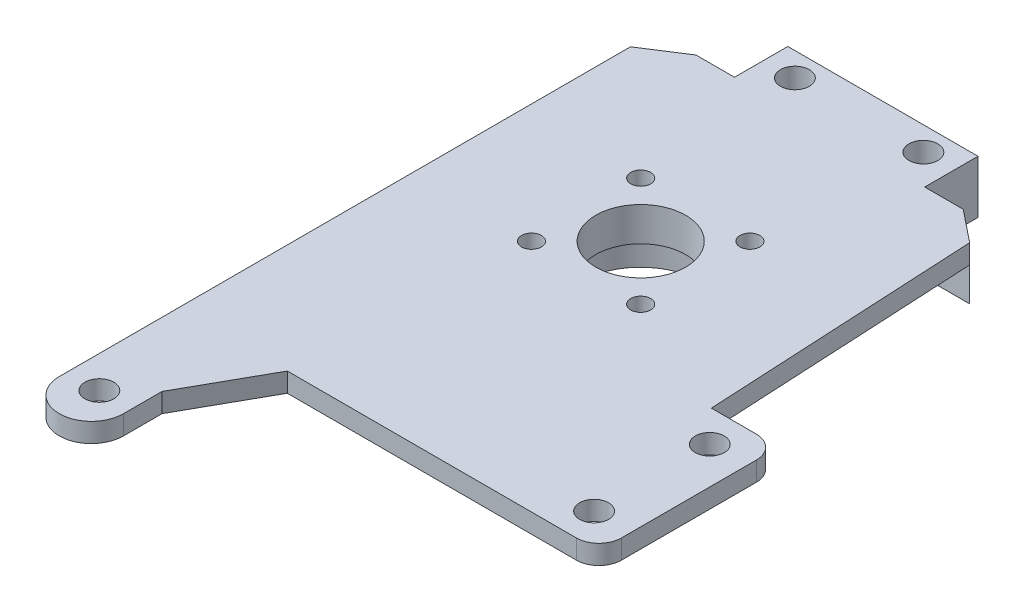
ISO-10303-21;
HEADER;
FILE_DESCRIPTION(('STEP AP214'),'2;1');
FILE_NAME('part.step','',(''),(''),'','','');
FILE_SCHEMA(('AUTOMOTIVE_DESIGN { 1 0 10303 214 1 1 1 1 }'));
ENDSEC;
DATA;
#1=APPLICATION_CONTEXT('core data for automotive mechanical design processes');
#2=APPLICATION_PROTOCOL_DEFINITION('international standard','automotive_design',2000,#1);
#3=PRODUCT_CONTEXT('',#1,'mechanical');
#4=PRODUCT('Part','Part','',(#3));
#5=PRODUCT_RELATED_PRODUCT_CATEGORY('part','',(#4));
#6=PRODUCT_DEFINITION_FORMATION('','',#4);
#7=PRODUCT_DEFINITION_CONTEXT('part definition',#1,'design');
#8=PRODUCT_DEFINITION('design','',#6,#7);
#9=PRODUCT_DEFINITION_SHAPE('','',#8);
#10=(LENGTH_UNIT() NAMED_UNIT(*) SI_UNIT(.MILLI.,.METRE.));
#11=(NAMED_UNIT(*) PLANE_ANGLE_UNIT() SI_UNIT($,.RADIAN.));
#12=(NAMED_UNIT(*) SI_UNIT($,.STERADIAN.) SOLID_ANGLE_UNIT());
#13=UNCERTAINTY_MEASURE_WITH_UNIT(LENGTH_MEASURE(1.E-05),#10,'distance_accuracy_value','');
#14=(GEOMETRIC_REPRESENTATION_CONTEXT(3) GLOBAL_UNCERTAINTY_ASSIGNED_CONTEXT((#13)) GLOBAL_UNIT_ASSIGNED_CONTEXT((#10,
#11,#12)) REPRESENTATION_CONTEXT('',''));
#15=CARTESIAN_POINT('',(0.,0.,0.));
#16=DIRECTION('',(0.,0.,1.));
#17=DIRECTION('',(1.,0.,0.));
#18=AXIS2_PLACEMENT_3D('',#15,#16,#17);
#19=CARTESIAN_POINT('',(0.,3.,4.59999999999998));
#20=DIRECTION('',(0.,0.,1.));
#21=DIRECTION('',(1.,0.,0.));
#22=AXIS2_PLACEMENT_3D('',#19,#20,#21);
#23=PLANE('',#22);
#24=DIRECTION('',(-1.,0.,0.));
#25=VECTOR('',#24,1.);
#26=CARTESIAN_POINT('',(0.,3.,4.59999999999998));
#27=LINE('',#26,#25);
#28=CARTESIAN_POINT('',(-14.8,3.,4.59999999999998));
#29=VERTEX_POINT('',#28);
#30=CARTESIAN_POINT('',(-20.8,3.,4.59999999999999));
#31=VERTEX_POINT('',#30);
#32=EDGE_CURVE('E359',#29,#31,#27,.T.);
#33=ORIENTED_EDGE('',*,*,#32,.F.);
#34=DIRECTION('',(0.,-1.,0.));
#35=VECTOR('',#34,1.);
#36=CARTESIAN_POINT('',(-14.8,3.,4.59999999999998));
#37=LINE('',#36,#35);
#38=CARTESIAN_POINT('',(-14.8,-5.25,4.59999999999998));
#39=VERTEX_POINT('',#38);
#40=EDGE_CURVE('E269',#29,#39,#37,.T.);
#41=ORIENTED_EDGE('',*,*,#40,.T.);
#42=DIRECTION('',(-1.,0.,0.));
#43=VECTOR('',#42,1.);
#44=CARTESIAN_POINT('',(0.,-5.25,4.59999999999998));
#45=LINE('',#44,#43);
#46=CARTESIAN_POINT('',(-20.8,-5.25,4.59999999999999));
#47=VERTEX_POINT('',#46);
#48=EDGE_CURVE('E240',#39,#47,#45,.T.);
#49=ORIENTED_EDGE('',*,*,#48,.T.);
#50=DIRECTION('',(0.,-1.,0.));
#51=VECTOR('',#50,1.);
#52=CARTESIAN_POINT('',(-20.8,3.,4.59999999999999));
#53=LINE('',#52,#51);
#54=EDGE_CURVE('E222',#31,#47,#53,.T.);
#55=ORIENTED_EDGE('',*,*,#54,.F.);
#56=EDGE_LOOP('',(#33,#41,#49,#55));
#57=FACE_BOUND('',#56,.T.);
#58=ADVANCED_FACE('F34',(#57),#23,.F.);
#59=CARTESIAN_POINT('',(0.,0.,0.));
#60=DIRECTION('',(0.,1.,0.));
#61=DIRECTION('',(0.,0.,1.));
#62=AXIS2_PLACEMENT_3D('',#59,#60,#61);
#63=PLANE('',#62);
#64=CARTESIAN_POINT('',(32.7500000000009,0.,55.9999999999991));
#65=DIRECTION('',(0.,1.,0.));
#66=DIRECTION('',(0.,0.,1.));
#67=AXIS2_PLACEMENT_3D('',#64,#65,#66);
#68=CIRCLE('',#67,2.24999999999883);
#69=CARTESIAN_POINT('',(32.7500000000009,0.,58.2499999999979));
#70=VERTEX_POINT('',#69);
#71=EDGE_CURVE('E342',#70,#70,#68,.T.);
#72=ORIENTED_EDGE('',*,*,#71,.T.);
#73=EDGE_LOOP('',(#72));
#74=FACE_BOUND('',#73,.T.);
#75=CARTESIAN_POINT('',(32.7500000000004,0.,73.9999999999994));
#76=DIRECTION('',(0.,1.,0.));
#77=DIRECTION('',(0.,0.,1.));
#78=AXIS2_PLACEMENT_3D('',#75,#76,#77);
#79=CIRCLE('',#78,2.24999999999944);
#80=CARTESIAN_POINT('',(32.7500000000004,0.,76.2499999999989));
#81=VERTEX_POINT('',#80);
#82=EDGE_CURVE('E416',#81,#81,#79,.T.);
#83=ORIENTED_EDGE('',*,*,#82,.T.);
#84=EDGE_LOOP('',(#83));
#85=FACE_BOUND('',#84,.T.);
#86=CARTESIAN_POINT('',(-22.0000000000012,0.,96.2500000000008));
#87=DIRECTION('',(0.,1.,0.));
#88=DIRECTION('',(0.,0.,1.));
#89=AXIS2_PLACEMENT_3D('',#86,#87,#88);
#90=CIRCLE('',#89,2.25000000000025);
#91=CARTESIAN_POINT('',(-22.0000000000012,0.,98.5000000000011));
#92=VERTEX_POINT('',#91);
#93=EDGE_CURVE('E413',#92,#92,#90,.T.);
#94=ORIENTED_EDGE('',*,*,#93,.T.);
#95=EDGE_LOOP('',(#94));
#96=FACE_BOUND('',#95,.T.);
#97=CARTESIAN_POINT('',(-8.5,0.,42.5));
#98=DIRECTION('',(0.,1.,0.));
#99=DIRECTION('',(0.,0.,1.));
#100=AXIS2_PLACEMENT_3D('',#97,#98,#99);
#101=CIRCLE('',#100,1.55);
#102=CARTESIAN_POINT('',(-7.80970070497113,0.,43.8877992950289));
#103=VERTEX_POINT('',#102);
#104=CARTESIAN_POINT('',(-9.88779929502888,0.,41.8097007049711));
#105=VERTEX_POINT('',#104);
#106=EDGE_CURVE('E313',#103,#105,#101,.F.);
#107=ORIENTED_EDGE('',*,*,#106,.F.);
#108=CARTESIAN_POINT('',(0.,0.,34.));
#109=DIRECTION('',(0.,1.,0.));
#110=DIRECTION('',(0.,0.,1.));
#111=AXIS2_PLACEMENT_3D('',#108,#109,#110);
#112=CIRCLE('',#111,12.6);
#113=CARTESIAN_POINT('',(7.80970070497112,0.,43.8877992950289));
#114=VERTEX_POINT('',#113);
#115=EDGE_CURVE('E333',#114,#103,#112,.F.);
#116=ORIENTED_EDGE('',*,*,#115,.F.);
#117=CARTESIAN_POINT('',(8.5,0.,42.5));
#118=DIRECTION('',(0.,1.,0.));
#119=DIRECTION('',(0.,0.,1.));
#120=AXIS2_PLACEMENT_3D('',#117,#118,#119);
#121=CIRCLE('',#120,1.55);
#122=CARTESIAN_POINT('',(9.88779929502888,0.,41.8097007049711));
#123=VERTEX_POINT('',#122);
#124=EDGE_CURVE('E307',#123,#114,#121,.F.);
#125=ORIENTED_EDGE('',*,*,#124,.F.);
#126=CARTESIAN_POINT('',(9.88779929502888,0.,26.1902992950289));
#127=VERTEX_POINT('',#126);
#128=EDGE_CURVE('E336',#127,#123,#112,.F.);
#129=ORIENTED_EDGE('',*,*,#128,.F.);
#130=CARTESIAN_POINT('',(8.5,0.,25.5));
#131=DIRECTION('',(0.,1.,0.));
#132=DIRECTION('',(0.,0.,1.));
#133=AXIS2_PLACEMENT_3D('',#130,#131,#132);
#134=CIRCLE('',#133,1.55);
#135=CARTESIAN_POINT('',(7.80970070497112,0.,24.1122007049711));
#136=VERTEX_POINT('',#135);
#137=EDGE_CURVE('E301',#136,#127,#134,.F.);
#138=ORIENTED_EDGE('',*,*,#137,.F.);
#139=CARTESIAN_POINT('',(-7.80970070497112,0.,24.1122007049711));
#140=VERTEX_POINT('',#139);
#141=EDGE_CURVE('E464',#140,#136,#112,.F.);
#142=ORIENTED_EDGE('',*,*,#141,.F.);
#143=CARTESIAN_POINT('',(-8.5,0.,25.5));
#144=DIRECTION('',(0.,1.,0.));
#145=DIRECTION('',(0.,0.,1.));
#146=AXIS2_PLACEMENT_3D('',#143,#144,#145);
#147=CIRCLE('',#146,1.55);
#148=CARTESIAN_POINT('',(-9.88779929502888,0.,26.1902992950289));
#149=VERTEX_POINT('',#148);
#150=EDGE_CURVE('E296',#149,#140,#147,.F.);
#151=ORIENTED_EDGE('',*,*,#150,.F.);
#152=EDGE_CURVE('E337',#105,#149,#112,.F.);
#153=ORIENTED_EDGE('',*,*,#152,.F.);
#154=EDGE_LOOP('',(#107,#116,#125,#129,#138,#142,#151,#153));
#155=FACE_BOUND('',#154,.T.);
#156=DIRECTION('',(-1.,0.,0.));
#157=VECTOR('',#156,1.);
#158=CARTESIAN_POINT('',(0.,0.,8.59999999999999));
#159=LINE('',#158,#157);
#160=CARTESIAN_POINT('',(25.8,0.,8.59999999999999));
#161=VERTEX_POINT('',#160);
#162=CARTESIAN_POINT('',(-27.0000000000001,0.,8.59999999999999));
#163=VERTEX_POINT('',#162);
#164=EDGE_CURVE('E11',#161,#163,#159,.T.);
#165=ORIENTED_EDGE('',*,*,#164,.F.);
#166=DIRECTION('',(0.0518170873393403,0.,0.998656592357787));
#167=VECTOR('',#166,1.);
#168=CARTESIAN_POINT('',(25.2856984355928,0.,-1.31199378675299));
#169=LINE('',#168,#167);
#170=CARTESIAN_POINT('',(28.0000000000009,0.,51.0000000000002));
#171=VERTEX_POINT('',#170);
#172=EDGE_CURVE('E399',#161,#171,#169,.T.);
#173=ORIENTED_EDGE('',*,*,#172,.T.);
#174=DIRECTION('',(1.,0.,0.));
#175=VECTOR('',#174,1.);
#176=CARTESIAN_POINT('',(-4.54993185984773E-13,0.,51.));
#177=LINE('',#176,#175);
#178=CARTESIAN_POINT('',(35.0000000000009,0.,51.0000000000003));
#179=VERTEX_POINT('',#178);
#180=EDGE_CURVE('E396',#171,#179,#177,.T.);
#181=ORIENTED_EDGE('',*,*,#180,.T.);
#182=CARTESIAN_POINT('',(35.0000000000009,0.,54.5000000000003));
#183=DIRECTION('',(0.,1.,0.));
#184=DIRECTION('',(0.,0.,1.));
#185=AXIS2_PLACEMENT_3D('',#182,#183,#184);
#186=CIRCLE('',#185,3.49999999999988);
#187=CARTESIAN_POINT('',(38.5000000000007,0.,54.5000000000013));
#188=VERTEX_POINT('',#187);
#189=EDGE_CURVE('E393',#179,#188,#186,.F.);
#190=ORIENTED_EDGE('',*,*,#189,.T.);
#191=DIRECTION('',(0.,0.,1.));
#192=VECTOR('',#191,1.);
#193=CARTESIAN_POINT('',(38.5000000000009,0.,1.39934360395466E-13));
#194=LINE('',#193,#192);
#195=CARTESIAN_POINT('',(38.5000000000006,0.,75.5000000000013));
#196=VERTEX_POINT('',#195);
#197=EDGE_CURVE('E390',#188,#196,#194,.T.);
#198=ORIENTED_EDGE('',*,*,#197,.T.);
#199=CARTESIAN_POINT('',(35.0000000000007,0.,75.5000000000003));
#200=DIRECTION('',(0.,1.,0.));
#201=DIRECTION('',(0.,0.,1.));
#202=AXIS2_PLACEMENT_3D('',#199,#200,#201);
#203=CIRCLE('',#202,3.49999999999992);
#204=CARTESIAN_POINT('',(35.0000000000007,0.,79.0000000000003));
#205=VERTEX_POINT('',#204);
#206=EDGE_CURVE('E387',#196,#205,#203,.F.);
#207=ORIENTED_EDGE('',*,*,#206,.T.);
#208=DIRECTION('',(-1.,0.,0.));
#209=VECTOR('',#208,1.);
#210=CARTESIAN_POINT('',(-3.16721957302788E-13,0.,79.0000000000001));
#211=LINE('',#210,#209);
#212=CARTESIAN_POINT('',(-9.9999999999993,0.,79.0000000000001));
#213=VERTEX_POINT('',#212);
#214=EDGE_CURVE('E384',#205,#213,#211,.T.);
#215=ORIENTED_EDGE('',*,*,#214,.T.);
#216=DIRECTION('',(0.488603368931869,0.,-0.872506015949706));
#217=VECTOR('',#216,1.);
#218=CARTESIAN_POINT('',(26.0657734470179,0.,14.596833130331));
#219=LINE('',#218,#217);
#220=CARTESIAN_POINT('',(-17.0000000000002,0.,91.5000000000008));
#221=VERTEX_POINT('',#220);
#222=EDGE_CURVE('E410',#221,#213,#219,.T.);
#223=ORIENTED_EDGE('',*,*,#222,.F.);
#224=DIRECTION('',(0.,0.,1.));
#225=VECTOR('',#224,1.);
#226=CARTESIAN_POINT('',(-17.0000000000001,0.,0.));
#227=LINE('',#226,#225);
#228=CARTESIAN_POINT('',(-17.0000000000002,0.,97.5000000000008));
#229=VERTEX_POINT('',#228);
#230=EDGE_CURVE('E407',#221,#229,#227,.T.);
#231=ORIENTED_EDGE('',*,*,#230,.T.);
#232=CARTESIAN_POINT('',(-22.0000000000002,0.,97.5000000000008));
#233=DIRECTION('',(0.,1.,0.));
#234=DIRECTION('',(0.,0.,1.));
#235=AXIS2_PLACEMENT_3D('',#232,#233,#234);
#236=CIRCLE('',#235,5.);
#237=CARTESIAN_POINT('',(-27.0000000000002,0.,97.5000000000008));
#238=VERTEX_POINT('',#237);
#239=EDGE_CURVE('E404',#238,#229,#236,.T.);
#240=ORIENTED_EDGE('',*,*,#239,.F.);
#241=DIRECTION('',(0.,0.,1.));
#242=VECTOR('',#241,1.);
#243=CARTESIAN_POINT('',(-27.0000000000002,0.,0.));
#244=LINE('',#243,#242);
#245=EDGE_CURVE('E402',#163,#238,#244,.T.);
#246=ORIENTED_EDGE('',*,*,#245,.F.);
#247=EDGE_LOOP('',(#165,#173,#181,#190,#198,#207,#215,#223,#231,#240,#246));
#248=FACE_BOUND('',#247,.T.);
#249=ADVANCED_FACE('F484',(#74,#85,#96,#155,#248),#63,.F.);
#250=CARTESIAN_POINT('',(0.,3.,0.));
#251=DIRECTION('',(0.,1.,0.));
#252=DIRECTION('',(0.,0.,1.));
#253=AXIS2_PLACEMENT_3D('',#250,#251,#252);
#254=PLANE('',#253);
#255=DIRECTION('',(0.840296648224249,0.,-0.542126869822085));
#256=VECTOR('',#255,1.);
#257=CARTESIAN_POINT('',(-4.01763409257883,3.,-6.22733284349732));
#258=LINE('',#257,#256);
#259=CARTESIAN_POINT('',(-27.0000000000001,3.,8.59999999999999));
#260=VERTEX_POINT('',#259);
#261=EDGE_CURVE('E363',#260,#31,#258,.T.);
#262=ORIENTED_EDGE('',*,*,#261,.F.);
#263=DIRECTION('',(0.,0.,1.));
#264=VECTOR('',#263,1.);
#265=CARTESIAN_POINT('',(-27.0000000000002,3.,0.));
#266=LINE('',#265,#264);
#267=CARTESIAN_POINT('',(-27.0000000000002,3.,97.5000000000008));
#268=VERTEX_POINT('',#267);
#269=EDGE_CURVE('E365',#260,#268,#266,.T.);
#270=ORIENTED_EDGE('',*,*,#269,.T.);
#271=CARTESIAN_POINT('',(-22.0000000000002,3.,97.5000000000008));
#272=DIRECTION('',(0.,1.,0.));
#273=DIRECTION('',(0.,0.,1.));
#274=AXIS2_PLACEMENT_3D('',#271,#272,#273);
#275=CIRCLE('',#274,5.);
#276=CARTESIAN_POINT('',(-17.0000000000002,3.,97.5000000000008));
#277=VERTEX_POINT('',#276);
#278=EDGE_CURVE('E367',#268,#277,#275,.T.);
#279=ORIENTED_EDGE('',*,*,#278,.T.);
#280=DIRECTION('',(0.,0.,1.));
#281=VECTOR('',#280,1.);
#282=CARTESIAN_POINT('',(-17.0000000000001,3.,0.));
#283=LINE('',#282,#281);
#284=CARTESIAN_POINT('',(-17.0000000000002,3.,91.5000000000008));
#285=VERTEX_POINT('',#284);
#286=EDGE_CURVE('E369',#285,#277,#283,.T.);
#287=ORIENTED_EDGE('',*,*,#286,.F.);
#288=DIRECTION('',(0.488603368931869,0.,-0.872506015949706));
#289=VECTOR('',#288,1.);
#290=CARTESIAN_POINT('',(26.0657734470179,3.,14.596833130331));
#291=LINE('',#290,#289);
#292=CARTESIAN_POINT('',(-9.9999999999993,3.,79.0000000000001));
#293=VERTEX_POINT('',#292);
#294=EDGE_CURVE('E372',#285,#293,#291,.T.);
#295=ORIENTED_EDGE('',*,*,#294,.T.);
#296=DIRECTION('',(-1.,0.,0.));
#297=VECTOR('',#296,1.);
#298=CARTESIAN_POINT('',(-3.16721957302788E-13,3.,79.0000000000001));
#299=LINE('',#298,#297);
#300=CARTESIAN_POINT('',(35.0000000000007,3.,79.0000000000003));
#301=VERTEX_POINT('',#300);
#302=EDGE_CURVE('E338',#301,#293,#299,.T.);
#303=ORIENTED_EDGE('',*,*,#302,.F.);
#304=CARTESIAN_POINT('',(35.0000000000007,3.,75.5000000000003));
#305=DIRECTION('',(0.,1.,0.));
#306=DIRECTION('',(0.,0.,1.));
#307=AXIS2_PLACEMENT_3D('',#304,#305,#306);
#308=CIRCLE('',#307,3.49999999999992);
#309=CARTESIAN_POINT('',(38.5000000000006,3.,75.5000000000013));
#310=VERTEX_POINT('',#309);
#311=EDGE_CURVE('E341',#310,#301,#308,.F.);
#312=ORIENTED_EDGE('',*,*,#311,.F.);
#313=DIRECTION('',(0.,0.,1.));
#314=VECTOR('',#313,1.);
#315=CARTESIAN_POINT('',(38.5000000000009,3.,1.39934360395466E-13));
#316=LINE('',#315,#314);
#317=CARTESIAN_POINT('',(38.5000000000007,3.,54.5000000000013));
#318=VERTEX_POINT('',#317);
#319=EDGE_CURVE('E345',#318,#310,#316,.T.);
#320=ORIENTED_EDGE('',*,*,#319,.F.);
#321=CARTESIAN_POINT('',(35.0000000000009,3.,54.5000000000003));
#322=DIRECTION('',(0.,1.,0.));
#323=DIRECTION('',(0.,0.,1.));
#324=AXIS2_PLACEMENT_3D('',#321,#322,#323);
#325=CIRCLE('',#324,3.49999999999988);
#326=CARTESIAN_POINT('',(35.0000000000009,3.,51.0000000000003));
#327=VERTEX_POINT('',#326);
#328=EDGE_CURVE('E348',#327,#318,#325,.F.);
#329=ORIENTED_EDGE('',*,*,#328,.F.);
#330=DIRECTION('',(1.,0.,0.));
#331=VECTOR('',#330,1.);
#332=CARTESIAN_POINT('',(-4.54993185984773E-13,3.,51.));
#333=LINE('',#332,#331);
#334=CARTESIAN_POINT('',(28.0000000000009,3.,51.0000000000002));
#335=VERTEX_POINT('',#334);
#336=EDGE_CURVE('E351',#335,#327,#333,.T.);
#337=ORIENTED_EDGE('',*,*,#336,.F.);
#338=DIRECTION('',(0.0518170873393403,0.,0.998656592357787));
#339=VECTOR('',#338,1.);
#340=CARTESIAN_POINT('',(25.2856984355928,3.,-1.31199378675299));
#341=LINE('',#340,#339);
#342=CARTESIAN_POINT('',(25.8,3.,8.59999999999999));
#343=VERTEX_POINT('',#342);
#344=EDGE_CURVE('E354',#343,#335,#341,.T.);
#345=ORIENTED_EDGE('',*,*,#344,.F.);
#346=DIRECTION('',(-0.780868809443032,0.,-0.624695047554423));
#347=VECTOR('',#346,1.);
#348=CARTESIAN_POINT('',(5.87317073170727,3.,-7.34146341463412));
#349=LINE('',#348,#347);
#350=CARTESIAN_POINT('',(20.8,3.,4.6));
#351=VERTEX_POINT('',#350);
#352=EDGE_CURVE('E357',#343,#351,#349,.T.);
#353=ORIENTED_EDGE('',*,*,#352,.T.);
#354=CARTESIAN_POINT('',(14.8,3.,4.6));
#355=VERTEX_POINT('',#354);
#356=EDGE_CURVE('E360',#351,#355,#27,.T.);
#357=ORIENTED_EDGE('',*,*,#356,.T.);
#358=DIRECTION('',(0.,0.,1.));
#359=VECTOR('',#358,1.);
#360=CARTESIAN_POINT('',(14.8,3.,0.));
#361=LINE('',#360,#359);
#362=CARTESIAN_POINT('',(14.8,3.,-3.70000000000001));
#363=VERTEX_POINT('',#362);
#364=EDGE_CURVE('E255',#363,#355,#361,.T.);
#365=ORIENTED_EDGE('',*,*,#364,.F.);
#366=DIRECTION('',(1.,0.,0.));
#367=VECTOR('',#366,1.);
#368=CARTESIAN_POINT('',(0.,3.,-3.70000000000025));
#369=LINE('',#368,#367);
#370=CARTESIAN_POINT('',(-14.8,3.,-3.7000000000005));
#371=VERTEX_POINT('',#370);
#372=EDGE_CURVE('E257',#371,#363,#369,.T.);
#373=ORIENTED_EDGE('',*,*,#372,.F.);
#374=DIRECTION('',(0.,0.,1.));
#375=VECTOR('',#374,1.);
#376=CARTESIAN_POINT('',(-14.8,3.,0.));
#377=LINE('',#376,#375);
#378=EDGE_CURVE('E260',#371,#29,#377,.T.);
#379=ORIENTED_EDGE('',*,*,#378,.T.);
#380=ORIENTED_EDGE('',*,*,#32,.T.);
#381=EDGE_LOOP('',(#262,#270,#279,#287,#295,#303,#312,#320,#329,#337,#345,#353,#357,#365,#373,
#379,#380));
#382=FACE_BOUND('',#381,.T.);
#383=CARTESIAN_POINT('',(-10.,3.,0.));
#384=DIRECTION('',(0.,1.,0.));
#385=DIRECTION('',(0.,0.,1.));
#386=AXIS2_PLACEMENT_3D('',#383,#384,#385);
#387=CIRCLE('',#386,2.25);
#388=CARTESIAN_POINT('',(-10.,3.,2.25));
#389=VERTEX_POINT('',#388);
#390=EDGE_CURVE('E266',#389,#389,#387,.T.);
#391=ORIENTED_EDGE('',*,*,#390,.F.);
#392=EDGE_LOOP('',(#391));
#393=FACE_BOUND('',#392,.T.);
#394=CARTESIAN_POINT('',(10.,3.,0.));
#395=DIRECTION('',(0.,1.,0.));
#396=DIRECTION('',(0.,0.,1.));
#397=AXIS2_PLACEMENT_3D('',#394,#395,#396);
#398=CIRCLE('',#397,2.25);
#399=CARTESIAN_POINT('',(10.,3.,2.25));
#400=VERTEX_POINT('',#399);
#401=EDGE_CURVE('E263',#400,#400,#398,.T.);
#402=ORIENTED_EDGE('',*,*,#401,.F.);
#403=EDGE_LOOP('',(#402));
#404=FACE_BOUND('',#403,.T.);
#405=CARTESIAN_POINT('',(8.5,3.,42.5));
#406=DIRECTION('',(0.,1.,0.));
#407=DIRECTION('',(0.,0.,1.));
#408=AXIS2_PLACEMENT_3D('',#405,#406,#407);
#409=CIRCLE('',#408,1.55);
#410=CARTESIAN_POINT('',(8.5,3.,44.05));
#411=VERTEX_POINT('',#410);
#412=EDGE_CURVE('E285',#411,#411,#409,.T.);
#413=ORIENTED_EDGE('',*,*,#412,.F.);
#414=EDGE_LOOP('',(#413));
#415=FACE_BOUND('',#414,.T.);
#416=CARTESIAN_POINT('',(-8.5,3.,25.5));
#417=DIRECTION('',(0.,1.,0.));
#418=DIRECTION('',(0.,0.,1.));
#419=AXIS2_PLACEMENT_3D('',#416,#417,#418);
#420=CIRCLE('',#419,1.55);
#421=CARTESIAN_POINT('',(-8.5,3.,27.05));
#422=VERTEX_POINT('',#421);
#423=EDGE_CURVE('E278',#422,#422,#420,.T.);
#424=ORIENTED_EDGE('',*,*,#423,.F.);
#425=EDGE_LOOP('',(#424));
#426=FACE_BOUND('',#425,.T.);
#427=CARTESIAN_POINT('',(-22.0000000000012,3.,96.2500000000008));
#428=DIRECTION('',(0.,1.,0.));
#429=DIRECTION('',(0.,0.,1.));
#430=AXIS2_PLACEMENT_3D('',#427,#428,#429);
#431=CIRCLE('',#430,2.25000000000025);
#432=CARTESIAN_POINT('',(-22.0000000000012,3.,98.5000000000011));
#433=VERTEX_POINT('',#432);
#434=EDGE_CURVE('E374',#433,#433,#431,.T.);
#435=ORIENTED_EDGE('',*,*,#434,.F.);
#436=EDGE_LOOP('',(#435));
#437=FACE_BOUND('',#436,.T.);
#438=CARTESIAN_POINT('',(32.7500000000004,3.,73.9999999999994));
#439=DIRECTION('',(0.,1.,0.));
#440=DIRECTION('',(0.,0.,1.));
#441=AXIS2_PLACEMENT_3D('',#438,#439,#440);
#442=CIRCLE('',#441,2.24999999999944);
#443=CARTESIAN_POINT('',(32.7500000000004,3.,76.2499999999989));
#444=VERTEX_POINT('',#443);
#445=EDGE_CURVE('E377',#444,#444,#442,.T.);
#446=ORIENTED_EDGE('',*,*,#445,.F.);
#447=EDGE_LOOP('',(#446));
#448=FACE_BOUND('',#447,.T.);
#449=CARTESIAN_POINT('',(32.7500000000009,3.,55.9999999999991));
#450=DIRECTION('',(0.,1.,0.));
#451=DIRECTION('',(0.,0.,1.));
#452=AXIS2_PLACEMENT_3D('',#449,#450,#451);
#453=CIRCLE('',#452,2.24999999999883);
#454=CARTESIAN_POINT('',(32.7500000000009,3.,58.2499999999979));
#455=VERTEX_POINT('',#454);
#456=EDGE_CURVE('E380',#455,#455,#453,.T.);
#457=ORIENTED_EDGE('',*,*,#456,.F.);
#458=EDGE_LOOP('',(#457));
#459=FACE_BOUND('',#458,.T.);
#460=CARTESIAN_POINT('',(0.,3.,34.));
#461=DIRECTION('',(0.,1.,0.));
#462=DIRECTION('',(0.,0.,1.));
#463=AXIS2_PLACEMENT_3D('',#460,#461,#462);
#464=CIRCLE('',#463,7.);
#465=CARTESIAN_POINT('',(0.,3.,41.));
#466=VERTEX_POINT('',#465);
#467=EDGE_CURVE('E322',#466,#466,#464,.T.);
#468=ORIENTED_EDGE('',*,*,#467,.F.);
#469=EDGE_LOOP('',(#468));
#470=FACE_BOUND('',#469,.T.);
#471=CARTESIAN_POINT('',(8.5,3.,25.5));
#472=DIRECTION('',(0.,1.,0.));
#473=DIRECTION('',(0.,0.,1.));
#474=AXIS2_PLACEMENT_3D('',#471,#472,#473);
#475=CIRCLE('',#474,1.55);
#476=CARTESIAN_POINT('',(8.5,3.,27.05));
#477=VERTEX_POINT('',#476);
#478=EDGE_CURVE('E282',#477,#477,#475,.T.);
#479=ORIENTED_EDGE('',*,*,#478,.F.);
#480=EDGE_LOOP('',(#479));
#481=FACE_BOUND('',#480,.T.);
#482=CARTESIAN_POINT('',(-8.5,3.,42.5));
#483=DIRECTION('',(0.,1.,0.));
#484=DIRECTION('',(0.,0.,1.));
#485=AXIS2_PLACEMENT_3D('',#482,#483,#484);
#486=CIRCLE('',#485,1.55);
#487=CARTESIAN_POINT('',(-8.5,3.,44.05));
#488=VERTEX_POINT('',#487);
#489=EDGE_CURVE('E289',#488,#488,#486,.T.);
#490=ORIENTED_EDGE('',*,*,#489,.F.);
#491=EDGE_LOOP('',(#490));
#492=FACE_BOUND('',#491,.T.);
#493=ADVANCED_FACE('F513',(#382,#393,#404,#415,#426,#437,#448,#459,#470,#481,#492),#254,.T.);
#494=CARTESIAN_POINT('',(0.,3.,34.));
#495=DIRECTION('',(0.,-1.,0.));
#496=DIRECTION('',(0.,0.,-1.));
#497=AXIS2_PLACEMENT_3D('',#494,#495,#496);
#498=CYLINDRICAL_SURFACE('',#497,12.6);
#499=DIRECTION('',(0.,-1.,0.));
#500=VECTOR('',#499,1.);
#501=CARTESIAN_POINT('',(-9.88779929502888,-2.15,41.8097007049711));
#502=LINE('',#501,#500);
#503=CARTESIAN_POINT('',(-9.88779929502888,-7.3,41.8097007049711));
#504=VERTEX_POINT('',#503);
#505=EDGE_CURVE('E49',#105,#504,#502,.T.);
#506=ORIENTED_EDGE('',*,*,#505,.F.);
#507=ORIENTED_EDGE('',*,*,#152,.T.);
#508=DIRECTION('',(0.,-1.,0.));
#509=VECTOR('',#508,1.);
#510=CARTESIAN_POINT('',(-9.88779929502888,-2.15,26.1902992950289));
#511=LINE('',#510,#509);
#512=CARTESIAN_POINT('',(-9.88779929502888,-7.3,26.1902992950289));
#513=VERTEX_POINT('',#512);
#514=EDGE_CURVE('E281',#513,#149,#511,.F.);
#515=ORIENTED_EDGE('',*,*,#514,.F.);
#516=CARTESIAN_POINT('',(0.,-7.3,34.));
#517=DIRECTION('',(0.,1.,0.));
#518=DIRECTION('',(0.,0.,1.));
#519=AXIS2_PLACEMENT_3D('',#516,#517,#518);
#520=CIRCLE('',#519,12.6);
#521=EDGE_CURVE('E331',#513,#504,#520,.T.);
#522=ORIENTED_EDGE('',*,*,#521,.T.);
#523=EDGE_LOOP('',(#506,#507,#515,#522));
#524=FACE_BOUND('',#523,.T.);
#525=ADVANCED_FACE('F471',(#524),#498,.T.);
#526=DIRECTION('',(0.,-1.,0.));
#527=VECTOR('',#526,1.);
#528=CARTESIAN_POINT('',(-7.80970070497112,-2.15,43.8877992950289));
#529=LINE('',#528,#527);
#530=CARTESIAN_POINT('',(-7.80970070497112,-7.3,43.8877992950289));
#531=VERTEX_POINT('',#530);
#532=EDGE_CURVE('E311',#531,#103,#529,.F.);
#533=ORIENTED_EDGE('',*,*,#532,.F.);
#534=CARTESIAN_POINT('',(7.80970070497112,-7.3,43.8877992950289));
#535=VERTEX_POINT('',#534);
#536=EDGE_CURVE('E328',#531,#535,#520,.T.);
#537=ORIENTED_EDGE('',*,*,#536,.T.);
#538=DIRECTION('',(0.,-1.,0.));
#539=VECTOR('',#538,1.);
#540=CARTESIAN_POINT('',(7.80970070497112,-2.15,43.8877992950289));
#541=LINE('',#540,#539);
#542=EDGE_CURVE('E309',#114,#535,#541,.T.);
#543=ORIENTED_EDGE('',*,*,#542,.F.);
#544=ORIENTED_EDGE('',*,*,#115,.T.);
#545=EDGE_LOOP('',(#533,#537,#543,#544));
#546=FACE_BOUND('',#545,.T.);
#547=ADVANCED_FACE('F479',(#546),#498,.T.);
#548=DIRECTION('',(0.,-1.,0.));
#549=VECTOR('',#548,1.);
#550=CARTESIAN_POINT('',(9.88779929502888,-2.15,41.8097007049711));
#551=LINE('',#550,#549);
#552=CARTESIAN_POINT('',(9.88779929502888,-7.3,41.8097007049711));
#553=VERTEX_POINT('',#552);
#554=EDGE_CURVE('E305',#553,#123,#551,.F.);
#555=ORIENTED_EDGE('',*,*,#554,.F.);
#556=CARTESIAN_POINT('',(9.88779929502888,-7.3,26.1902992950289));
#557=VERTEX_POINT('',#556);
#558=EDGE_CURVE('E332',#553,#557,#520,.T.);
#559=ORIENTED_EDGE('',*,*,#558,.T.);
#560=DIRECTION('',(0.,-1.,0.));
#561=VECTOR('',#560,1.);
#562=CARTESIAN_POINT('',(9.88779929502887,-2.15,26.1902992950289));
#563=LINE('',#562,#561);
#564=EDGE_CURVE('E303',#127,#557,#563,.T.);
#565=ORIENTED_EDGE('',*,*,#564,.F.);
#566=ORIENTED_EDGE('',*,*,#128,.T.);
#567=EDGE_LOOP('',(#555,#559,#565,#566));
#568=FACE_BOUND('',#567,.T.);
#569=ADVANCED_FACE('F491',(#568),#498,.T.);
#570=DIRECTION('',(0.,-1.,0.));
#571=VECTOR('',#570,1.);
#572=CARTESIAN_POINT('',(7.80970070497112,-2.15,24.1122007049711));
#573=LINE('',#572,#571);
#574=CARTESIAN_POINT('',(7.80970070497112,-7.3,24.1122007049711));
#575=VERTEX_POINT('',#574);
#576=EDGE_CURVE('E299',#575,#136,#573,.F.);
#577=ORIENTED_EDGE('',*,*,#576,.F.);
#578=CARTESIAN_POINT('',(-7.80970070497112,-7.3,24.1122007049711));
#579=VERTEX_POINT('',#578);
#580=EDGE_CURVE('E462',#575,#579,#520,.T.);
#581=ORIENTED_EDGE('',*,*,#580,.T.);
#582=DIRECTION('',(0.,-1.,0.));
#583=VECTOR('',#582,1.);
#584=CARTESIAN_POINT('',(-7.80970070497112,-2.15,24.1122007049711));
#585=LINE('',#584,#583);
#586=EDGE_CURVE('E57',#140,#579,#585,.T.);
#587=ORIENTED_EDGE('',*,*,#586,.F.);
#588=ORIENTED_EDGE('',*,*,#141,.T.);
#589=EDGE_LOOP('',(#577,#581,#587,#588));
#590=FACE_BOUND('',#589,.T.);
#591=ADVANCED_FACE('F461',(#590),#498,.T.);
#592=CARTESIAN_POINT('',(0.,3.,34.));
#593=DIRECTION('',(0.,-1.,0.));
#594=DIRECTION('',(0.,0.,-1.));
#595=AXIS2_PLACEMENT_3D('',#592,#593,#594);
#596=CYLINDRICAL_SURFACE('',#595,9.6);
#597=CARTESIAN_POINT('',(0.,-7.3,34.));
#598=DIRECTION('',(0.,1.,0.));
#599=DIRECTION('',(0.,0.,1.));
#600=AXIS2_PLACEMENT_3D('',#597,#598,#599);
#601=CIRCLE('',#600,9.6);
#602=CARTESIAN_POINT('',(0.,-7.3,43.6));
#603=VERTEX_POINT('',#602);
#604=EDGE_CURVE('E325',#603,#603,#601,.T.);
#605=ORIENTED_EDGE('',*,*,#604,.F.);
#606=EDGE_LOOP('',(#605));
#607=FACE_BOUND('',#606,.T.);
#608=CARTESIAN_POINT('',(0.,-2.3,34.));
#609=DIRECTION('',(0.,1.,0.));
#610=DIRECTION('',(0.,0.,1.));
#611=AXIS2_PLACEMENT_3D('',#608,#609,#610);
#612=CIRCLE('',#611,9.6);
#613=CARTESIAN_POINT('',(0.,-2.3,43.6));
#614=VERTEX_POINT('',#613);
#615=EDGE_CURVE('E319',#614,#614,#612,.T.);
#616=ORIENTED_EDGE('',*,*,#615,.T.);
#617=EDGE_LOOP('',(#616));
#618=FACE_BOUND('',#617,.T.);
#619=ADVANCED_FACE('F659',(#607,#618),#596,.F.);
#620=CARTESIAN_POINT('',(-3.16721957302788E-13,3.,79.0000000000001));
#621=DIRECTION('',(0.,0.,1.));
#622=DIRECTION('',(1.,0.,0.));
#623=AXIS2_PLACEMENT_3D('',#620,#621,#622);
#624=PLANE('',#623);
#625=ORIENTED_EDGE('',*,*,#214,.F.);
#626=DIRECTION('',(0.,-1.,0.));
#627=VECTOR('',#626,1.);
#628=CARTESIAN_POINT('',(35.0000000000007,3.,79.0000000000003));
#629=LINE('',#628,#627);
#630=EDGE_CURVE('E445',#301,#205,#629,.T.);
#631=ORIENTED_EDGE('',*,*,#630,.F.);
#632=ORIENTED_EDGE('',*,*,#302,.T.);
#633=DIRECTION('',(0.,-1.,0.));
#634=VECTOR('',#633,1.);
#635=CARTESIAN_POINT('',(-9.9999999999993,3.,79.0000000000001));
#636=LINE('',#635,#634);
#637=EDGE_CURVE('E383',#293,#213,#636,.T.);
#638=ORIENTED_EDGE('',*,*,#637,.T.);
#639=EDGE_LOOP('',(#625,#631,#632,#638));
#640=FACE_BOUND('',#639,.T.);
#641=ADVANCED_FACE('F36',(#640),#624,.T.);
#642=CARTESIAN_POINT('',(35.0000000000007,3.,75.5000000000003));
#643=DIRECTION('',(0.,-1.,0.));
#644=DIRECTION('',(0.,0.,-1.));
#645=AXIS2_PLACEMENT_3D('',#642,#643,#644);
#646=CYLINDRICAL_SURFACE('',#645,3.49999999999992);
#647=ORIENTED_EDGE('',*,*,#206,.F.);
#648=DIRECTION('',(0.,-1.,0.));
#649=VECTOR('',#648,1.);
#650=CARTESIAN_POINT('',(38.5000000000006,3.,75.5000000000013));
#651=LINE('',#650,#649);
#652=EDGE_CURVE('E443',#310,#196,#651,.T.);
#653=ORIENTED_EDGE('',*,*,#652,.F.);
#654=ORIENTED_EDGE('',*,*,#311,.T.);
#655=ORIENTED_EDGE('',*,*,#630,.T.);
#656=EDGE_LOOP('',(#647,#653,#654,#655));
#657=FACE_BOUND('',#656,.T.);
#658=ADVANCED_FACE('F576',(#657),#646,.T.);
#659=CARTESIAN_POINT('',(38.5000000000009,3.,1.39934360395466E-13));
#660=DIRECTION('',(1.,0.,0.));
#661=DIRECTION('',(0.,0.,-1.));
#662=AXIS2_PLACEMENT_3D('',#659,#660,#661);
#663=PLANE('',#662);
#664=ORIENTED_EDGE('',*,*,#197,.F.);
#665=DIRECTION('',(0.,-1.,0.));
#666=VECTOR('',#665,1.);
#667=CARTESIAN_POINT('',(38.5000000000007,3.,54.5000000000013));
#668=LINE('',#667,#666);
#669=EDGE_CURVE('E441',#318,#188,#668,.T.);
#670=ORIENTED_EDGE('',*,*,#669,.F.);
#671=ORIENTED_EDGE('',*,*,#319,.T.);
#672=ORIENTED_EDGE('',*,*,#652,.T.);
#673=EDGE_LOOP('',(#664,#670,#671,#672));
#674=FACE_BOUND('',#673,.T.);
#675=ADVANCED_FACE('F572',(#674),#663,.T.);
#676=CARTESIAN_POINT('',(35.0000000000009,3.,54.5000000000003));
#677=DIRECTION('',(0.,-1.,0.));
#678=DIRECTION('',(0.,0.,-1.));
#679=AXIS2_PLACEMENT_3D('',#676,#677,#678);
#680=CYLINDRICAL_SURFACE('',#679,3.49999999999988);
#681=ORIENTED_EDGE('',*,*,#189,.F.);
#682=DIRECTION('',(0.,-1.,0.));
#683=VECTOR('',#682,1.);
#684=CARTESIAN_POINT('',(35.0000000000009,3.,51.0000000000003));
#685=LINE('',#684,#683);
#686=EDGE_CURVE('E439',#327,#179,#685,.T.);
#687=ORIENTED_EDGE('',*,*,#686,.F.);
#688=ORIENTED_EDGE('',*,*,#328,.T.);
#689=ORIENTED_EDGE('',*,*,#669,.T.);
#690=EDGE_LOOP('',(#681,#687,#688,#689));
#691=FACE_BOUND('',#690,.T.);
#692=ADVANCED_FACE('F569',(#691),#680,.T.);
#693=CARTESIAN_POINT('',(-4.54993185984773E-13,3.,51.));
#694=DIRECTION('',(0.,0.,-1.));
#695=DIRECTION('',(-1.,0.,0.));
#696=AXIS2_PLACEMENT_3D('',#693,#694,#695);
#697=PLANE('',#696);
#698=ORIENTED_EDGE('',*,*,#180,.F.);
#699=DIRECTION('',(0.,-1.,0.));
#700=VECTOR('',#699,1.);
#701=CARTESIAN_POINT('',(28.0000000000009,3.,51.0000000000002));
#702=LINE('',#701,#700);
#703=EDGE_CURVE('E437',#335,#171,#702,.T.);
#704=ORIENTED_EDGE('',*,*,#703,.F.);
#705=ORIENTED_EDGE('',*,*,#336,.T.);
#706=ORIENTED_EDGE('',*,*,#686,.T.);
#707=EDGE_LOOP('',(#698,#704,#705,#706));
#708=FACE_BOUND('',#707,.T.);
#709=ADVANCED_FACE('F565',(#708),#697,.T.);
#710=CARTESIAN_POINT('',(25.2856984355928,3.,-1.31199378675299));
#711=DIRECTION('',(0.998656592357787,0.,-0.0518170873393403));
#712=DIRECTION('',(-0.0518170873393403,0.,-0.998656592357787));
#713=AXIS2_PLACEMENT_3D('',#710,#711,#712);
#714=PLANE('',#713);
#715=ORIENTED_EDGE('',*,*,#172,.F.);
#716=DIRECTION('',(0.,-1.,0.));
#717=VECTOR('',#716,1.);
#718=CARTESIAN_POINT('',(25.8,3.,8.59999999999999));
#719=LINE('',#718,#717);
#720=EDGE_CURVE('E434',#343,#161,#719,.T.);
#721=ORIENTED_EDGE('',*,*,#720,.F.);
#722=ORIENTED_EDGE('',*,*,#344,.T.);
#723=ORIENTED_EDGE('',*,*,#703,.T.);
#724=EDGE_LOOP('',(#715,#721,#722,#723));
#725=FACE_BOUND('',#724,.T.);
#726=ADVANCED_FACE('F527',(#725),#714,.T.);
#727=CARTESIAN_POINT('',(5.87317073170727,3.,-7.34146341463412));
#728=DIRECTION('',(-0.624695047554423,0.,0.780868809443032));
#729=DIRECTION('',(0.780868809443032,0.,0.624695047554423));
#730=AXIS2_PLACEMENT_3D('',#727,#728,#729);
#731=PLANE('',#730);
#732=ORIENTED_EDGE('',*,*,#720,.T.);
#733=DIRECTION('',(0.,-1.,0.));
#734=VECTOR('',#733,1.);
#735=CARTESIAN_POINT('',(25.8,3.,8.59999999999999));
#736=LINE('',#735,#734);
#737=CARTESIAN_POINT('',(25.8,-5.25,8.59999999999999));
#738=VERTEX_POINT('',#737);
#739=EDGE_CURVE('E215',#161,#738,#736,.T.);
#740=ORIENTED_EDGE('',*,*,#739,.T.);
#741=DIRECTION('',(-0.780868809443032,0.,-0.624695047554423));
#742=VECTOR('',#741,1.);
#743=CARTESIAN_POINT('',(5.87317073170727,-5.25,-7.34146341463412));
#744=LINE('',#743,#742);
#745=CARTESIAN_POINT('',(20.8,-5.25,4.6));
#746=VERTEX_POINT('',#745);
#747=EDGE_CURVE('E232',#738,#746,#744,.T.);
#748=ORIENTED_EDGE('',*,*,#747,.T.);
#749=DIRECTION('',(0.,-1.,0.));
#750=VECTOR('',#749,1.);
#751=CARTESIAN_POINT('',(20.8,3.,4.6));
#752=LINE('',#751,#750);
#753=EDGE_CURVE('E432',#351,#746,#752,.T.);
#754=ORIENTED_EDGE('',*,*,#753,.F.);
#755=ORIENTED_EDGE('',*,*,#352,.F.);
#756=EDGE_LOOP('',(#732,#740,#748,#754,#755));
#757=FACE_BOUND('',#756,.T.);
#758=ADVANCED_FACE('F520',(#757),#731,.F.);
#759=ORIENTED_EDGE('',*,*,#753,.T.);
#760=CARTESIAN_POINT('',(14.8,-5.25,4.6));
#761=VERTEX_POINT('',#760);
#762=EDGE_CURVE('E234',#746,#761,#45,.T.);
#763=ORIENTED_EDGE('',*,*,#762,.T.);
#764=DIRECTION('',(0.,-1.,0.));
#765=VECTOR('',#764,1.);
#766=CARTESIAN_POINT('',(14.8,3.,4.6));
#767=LINE('',#766,#765);
#768=EDGE_CURVE('E275',#355,#761,#767,.T.);
#769=ORIENTED_EDGE('',*,*,#768,.F.);
#770=ORIENTED_EDGE('',*,*,#356,.F.);
#771=EDGE_LOOP('',(#759,#763,#769,#770));
#772=FACE_BOUND('',#771,.T.);
#773=ADVANCED_FACE('F509',(#772),#23,.F.);
#774=CARTESIAN_POINT('',(-4.01763409257883,3.,-6.22733284349732));
#775=DIRECTION('',(-0.542126869822085,0.,-0.840296648224249));
#776=DIRECTION('',(-0.840296648224249,0.,0.542126869822085));
#777=AXIS2_PLACEMENT_3D('',#774,#775,#776);
#778=PLANE('',#777);
#779=ORIENTED_EDGE('',*,*,#54,.T.);
#780=DIRECTION('',(0.840296648224249,0.,-0.542126869822085));
#781=VECTOR('',#780,1.);
#782=CARTESIAN_POINT('',(-4.01763409257883,-5.25,-6.22733284349732));
#783=LINE('',#782,#781);
#784=CARTESIAN_POINT('',(-27.0000000000001,-5.25,8.59999999999999));
#785=VERTEX_POINT('',#784);
#786=EDGE_CURVE('E218',#785,#47,#783,.T.);
#787=ORIENTED_EDGE('',*,*,#786,.F.);
#788=DIRECTION('',(0.,-1.,0.));
#789=VECTOR('',#788,1.);
#790=CARTESIAN_POINT('',(-27.0000000000001,3.,8.59999999999999));
#791=LINE('',#790,#789);
#792=EDGE_CURVE('E206',#163,#785,#791,.T.);
#793=ORIENTED_EDGE('',*,*,#792,.F.);
#794=DIRECTION('',(0.,-1.,0.));
#795=VECTOR('',#794,1.);
#796=CARTESIAN_POINT('',(-27.0000000000001,3.,8.59999999999999));
#797=LINE('',#796,#795);
#798=EDGE_CURVE('E429',#260,#163,#797,.T.);
#799=ORIENTED_EDGE('',*,*,#798,.F.);
#800=ORIENTED_EDGE('',*,*,#261,.T.);
#801=EDGE_LOOP('',(#779,#787,#793,#799,#800));
#802=FACE_BOUND('',#801,.T.);
#803=ADVANCED_FACE('F219',(#802),#778,.T.);
#804=CARTESIAN_POINT('',(-27.0000000000002,3.,0.));
#805=DIRECTION('',(1.,0.,0.));
#806=DIRECTION('',(0.,0.,-1.));
#807=AXIS2_PLACEMENT_3D('',#804,#805,#806);
#808=PLANE('',#807);
#809=ORIENTED_EDGE('',*,*,#245,.T.);
#810=DIRECTION('',(0.,-1.,0.));
#811=VECTOR('',#810,1.);
#812=CARTESIAN_POINT('',(-27.0000000000002,3.,97.5000000000008));
#813=LINE('',#812,#811);
#814=EDGE_CURVE('E426',#268,#238,#813,.T.);
#815=ORIENTED_EDGE('',*,*,#814,.F.);
#816=ORIENTED_EDGE('',*,*,#269,.F.);
#817=ORIENTED_EDGE('',*,*,#798,.T.);
#818=EDGE_LOOP('',(#809,#815,#816,#817));
#819=FACE_BOUND('',#818,.T.);
#820=ADVANCED_FACE('F526',(#819),#808,.F.);
#821=CARTESIAN_POINT('',(-22.0000000000002,3.,97.5000000000008));
#822=DIRECTION('',(0.,-1.,0.));
#823=DIRECTION('',(0.,0.,-1.));
#824=AXIS2_PLACEMENT_3D('',#821,#822,#823);
#825=CYLINDRICAL_SURFACE('',#824,5.);
#826=ORIENTED_EDGE('',*,*,#239,.T.);
#827=DIRECTION('',(0.,-1.,0.));
#828=VECTOR('',#827,1.);
#829=CARTESIAN_POINT('',(-17.0000000000002,3.,97.5000000000008));
#830=LINE('',#829,#828);
#831=EDGE_CURVE('E424',#277,#229,#830,.T.);
#832=ORIENTED_EDGE('',*,*,#831,.F.);
#833=ORIENTED_EDGE('',*,*,#278,.F.);
#834=ORIENTED_EDGE('',*,*,#814,.T.);
#835=EDGE_LOOP('',(#826,#832,#833,#834));
#836=FACE_BOUND('',#835,.T.);
#837=ADVANCED_FACE('F542',(#836),#825,.T.);
#838=CARTESIAN_POINT('',(-17.0000000000001,3.,0.));
#839=DIRECTION('',(1.,0.,0.));
#840=DIRECTION('',(0.,0.,-1.));
#841=AXIS2_PLACEMENT_3D('',#838,#839,#840);
#842=PLANE('',#841);
#843=ORIENTED_EDGE('',*,*,#230,.F.);
#844=DIRECTION('',(0.,-1.,0.));
#845=VECTOR('',#844,1.);
#846=CARTESIAN_POINT('',(-17.0000000000002,3.,91.5000000000008));
#847=LINE('',#846,#845);
#848=EDGE_CURVE('E422',#285,#221,#847,.T.);
#849=ORIENTED_EDGE('',*,*,#848,.F.);
#850=ORIENTED_EDGE('',*,*,#286,.T.);
#851=ORIENTED_EDGE('',*,*,#831,.T.);
#852=EDGE_LOOP('',(#843,#849,#850,#851));
#853=FACE_BOUND('',#852,.T.);
#854=ADVANCED_FACE('F587',(#853),#842,.T.);
#855=CARTESIAN_POINT('',(32.7500000000004,3.,73.9999999999994));
#856=DIRECTION('',(0.,-1.,0.));
#857=DIRECTION('',(0.,0.,-1.));
#858=AXIS2_PLACEMENT_3D('',#855,#856,#857);
#859=CYLINDRICAL_SURFACE('',#858,2.24999999999944);
#860=ORIENTED_EDGE('',*,*,#445,.T.);
#861=EDGE_LOOP('',(#860));
#862=FACE_BOUND('',#861,.T.);
#863=ORIENTED_EDGE('',*,*,#82,.F.);
#864=EDGE_LOOP('',(#863));
#865=FACE_BOUND('',#864,.T.);
#866=ADVANCED_FACE('F589',(#862,#865),#859,.F.);
#867=CARTESIAN_POINT('',(-22.0000000000012,3.,96.2500000000008));
#868=DIRECTION('',(0.,-1.,0.));
#869=DIRECTION('',(0.,0.,-1.));
#870=AXIS2_PLACEMENT_3D('',#867,#868,#869);
#871=CYLINDRICAL_SURFACE('',#870,2.25000000000025);
#872=ORIENTED_EDGE('',*,*,#434,.T.);
#873=EDGE_LOOP('',(#872));
#874=FACE_BOUND('',#873,.T.);
#875=ORIENTED_EDGE('',*,*,#93,.F.);
#876=EDGE_LOOP('',(#875));
#877=FACE_BOUND('',#876,.T.);
#878=ADVANCED_FACE('F595',(#874,#877),#871,.F.);
#879=CARTESIAN_POINT('',(26.0657734470179,3.,14.596833130331));
#880=DIRECTION('',(-0.872506015949705,0.,-0.488603368931869));
#881=DIRECTION('',(-0.488603368931869,0.,0.872506015949706));
#882=AXIS2_PLACEMENT_3D('',#879,#880,#881);
#883=PLANE('',#882);
#884=ORIENTED_EDGE('',*,*,#222,.T.);
#885=ORIENTED_EDGE('',*,*,#637,.F.);
#886=ORIENTED_EDGE('',*,*,#294,.F.);
#887=ORIENTED_EDGE('',*,*,#848,.T.);
#888=EDGE_LOOP('',(#884,#885,#886,#887));
#889=FACE_BOUND('',#888,.T.);
#890=ADVANCED_FACE('F585',(#889),#883,.F.);
#891=CARTESIAN_POINT('',(32.7500000000009,3.,55.9999999999991));
#892=DIRECTION('',(0.,-1.,0.));
#893=DIRECTION('',(0.,0.,-1.));
#894=AXIS2_PLACEMENT_3D('',#891,#892,#893);
#895=CYLINDRICAL_SURFACE('',#894,2.24999999999883);
#896=ORIENTED_EDGE('',*,*,#456,.T.);
#897=EDGE_LOOP('',(#896));
#898=FACE_BOUND('',#897,.T.);
#899=ORIENTED_EDGE('',*,*,#71,.F.);
#900=EDGE_LOOP('',(#899));
#901=FACE_BOUND('',#900,.T.);
#902=ADVANCED_FACE('F644',(#898,#901),#895,.F.);
#903=CARTESIAN_POINT('',(0.,-7.3,0.));
#904=DIRECTION('',(0.,1.,0.));
#905=DIRECTION('',(0.,0.,1.));
#906=AXIS2_PLACEMENT_3D('',#903,#904,#905);
#907=PLANE('',#906);
#908=CARTESIAN_POINT('',(-8.5,-7.3,42.5));
#909=DIRECTION('',(0.,1.,0.));
#910=DIRECTION('',(0.,0.,1.));
#911=AXIS2_PLACEMENT_3D('',#908,#909,#910);
#912=CIRCLE('',#911,1.55);
#913=EDGE_CURVE('E214',#531,#504,#912,.T.);
#914=ORIENTED_EDGE('',*,*,#913,.T.);
#915=ORIENTED_EDGE('',*,*,#521,.F.);
#916=CARTESIAN_POINT('',(-8.5,-7.3,25.5));
#917=DIRECTION('',(0.,1.,0.));
#918=DIRECTION('',(0.,0.,1.));
#919=AXIS2_PLACEMENT_3D('',#916,#917,#918);
#920=CIRCLE('',#919,1.55);
#921=EDGE_CURVE('E447',#579,#513,#920,.F.);
#922=ORIENTED_EDGE('',*,*,#921,.F.);
#923=ORIENTED_EDGE('',*,*,#580,.F.);
#924=CARTESIAN_POINT('',(8.5,-7.3,25.5));
#925=DIRECTION('',(0.,1.,0.));
#926=DIRECTION('',(0.,0.,1.));
#927=AXIS2_PLACEMENT_3D('',#924,#925,#926);
#928=CIRCLE('',#927,1.55);
#929=EDGE_CURVE('E42',#557,#575,#928,.F.);
#930=ORIENTED_EDGE('',*,*,#929,.F.);
#931=ORIENTED_EDGE('',*,*,#558,.F.);
#932=CARTESIAN_POINT('',(8.5,-7.3,42.5));
#933=DIRECTION('',(0.,1.,0.));
#934=DIRECTION('',(0.,0.,1.));
#935=AXIS2_PLACEMENT_3D('',#932,#933,#934);
#936=CIRCLE('',#935,1.55);
#937=EDGE_CURVE('E286',#553,#535,#936,.T.);
#938=ORIENTED_EDGE('',*,*,#937,.T.);
#939=ORIENTED_EDGE('',*,*,#536,.F.);
#940=EDGE_LOOP('',(#914,#915,#922,#923,#930,#931,#938,#939));
#941=FACE_BOUND('',#940,.T.);
#942=ORIENTED_EDGE('',*,*,#604,.T.);
#943=EDGE_LOOP('',(#942));
#944=FACE_BOUND('',#943,.T.);
#945=ADVANCED_FACE('F465',(#941,#944),#907,.F.);
#946=CARTESIAN_POINT('',(0.,3.,34.));
#947=DIRECTION('',(0.,-1.,0.));
#948=DIRECTION('',(0.,0.,-1.));
#949=AXIS2_PLACEMENT_3D('',#946,#947,#948);
#950=CYLINDRICAL_SURFACE('',#949,7.);
#951=ORIENTED_EDGE('',*,*,#467,.T.);
#952=EDGE_LOOP('',(#951));
#953=FACE_BOUND('',#952,.T.);
#954=CARTESIAN_POINT('',(0.,-2.3,34.));
#955=DIRECTION('',(0.,1.,0.));
#956=DIRECTION('',(0.,0.,1.));
#957=AXIS2_PLACEMENT_3D('',#954,#955,#956);
#958=CIRCLE('',#957,7.);
#959=CARTESIAN_POINT('',(0.,-2.3,41.));
#960=VERTEX_POINT('',#959);
#961=EDGE_CURVE('E316',#960,#960,#958,.T.);
#962=ORIENTED_EDGE('',*,*,#961,.F.);
#963=EDGE_LOOP('',(#962));
#964=FACE_BOUND('',#963,.T.);
#965=ADVANCED_FACE('F672',(#953,#964),#950,.F.);
#966=CARTESIAN_POINT('',(0.,-2.3,0.));
#967=DIRECTION('',(0.,1.,0.));
#968=DIRECTION('',(0.,0.,1.));
#969=AXIS2_PLACEMENT_3D('',#966,#967,#968);
#970=PLANE('',#969);
#971=ORIENTED_EDGE('',*,*,#961,.T.);
#972=EDGE_LOOP('',(#971));
#973=FACE_BOUND('',#972,.T.);
#974=ORIENTED_EDGE('',*,*,#615,.F.);
#975=EDGE_LOOP('',(#974));
#976=FACE_BOUND('',#975,.T.);
#977=ADVANCED_FACE('F676',(#973,#976),#970,.F.);
#978=CARTESIAN_POINT('',(-8.5,3.,25.5));
#979=DIRECTION('',(0.,-1.,0.));
#980=DIRECTION('',(0.,0.,-1.));
#981=AXIS2_PLACEMENT_3D('',#978,#979,#980);
#982=CYLINDRICAL_SURFACE('',#981,1.55);
#983=ORIENTED_EDGE('',*,*,#423,.T.);
#984=EDGE_LOOP('',(#983));
#985=FACE_BOUND('',#984,.T.);
#986=ORIENTED_EDGE('',*,*,#586,.T.);
#987=ORIENTED_EDGE('',*,*,#921,.T.);
#988=ORIENTED_EDGE('',*,*,#514,.T.);
#989=ORIENTED_EDGE('',*,*,#150,.T.);
#990=EDGE_LOOP('',(#986,#987,#988,#989));
#991=FACE_BOUND('',#990,.T.);
#992=ADVANCED_FACE('F503',(#985,#991),#982,.F.);
#993=CARTESIAN_POINT('',(8.5,3.,25.5));
#994=DIRECTION('',(0.,-1.,0.));
#995=DIRECTION('',(0.,0.,-1.));
#996=AXIS2_PLACEMENT_3D('',#993,#994,#995);
#997=CYLINDRICAL_SURFACE('',#996,1.55);
#998=ORIENTED_EDGE('',*,*,#478,.T.);
#999=EDGE_LOOP('',(#998));
#1000=FACE_BOUND('',#999,.T.);
#1001=ORIENTED_EDGE('',*,*,#564,.T.);
#1002=ORIENTED_EDGE('',*,*,#929,.T.);
#1003=ORIENTED_EDGE('',*,*,#576,.T.);
#1004=ORIENTED_EDGE('',*,*,#137,.T.);
#1005=EDGE_LOOP('',(#1001,#1002,#1003,#1004));
#1006=FACE_BOUND('',#1005,.T.);
#1007=ADVANCED_FACE('F451',(#1000,#1006),#997,.F.);
#1008=CARTESIAN_POINT('',(8.5,3.,42.5));
#1009=DIRECTION('',(0.,-1.,0.));
#1010=DIRECTION('',(0.,0.,-1.));
#1011=AXIS2_PLACEMENT_3D('',#1008,#1009,#1010);
#1012=CYLINDRICAL_SURFACE('',#1011,1.55);
#1013=ORIENTED_EDGE('',*,*,#412,.T.);
#1014=EDGE_LOOP('',(#1013));
#1015=FACE_BOUND('',#1014,.T.);
#1016=ORIENTED_EDGE('',*,*,#542,.T.);
#1017=ORIENTED_EDGE('',*,*,#937,.F.);
#1018=ORIENTED_EDGE('',*,*,#554,.T.);
#1019=ORIENTED_EDGE('',*,*,#124,.T.);
#1020=EDGE_LOOP('',(#1016,#1017,#1018,#1019));
#1021=FACE_BOUND('',#1020,.T.);
#1022=ADVANCED_FACE('F493',(#1015,#1021),#1012,.F.);
#1023=CARTESIAN_POINT('',(-8.5,3.,42.5));
#1024=DIRECTION('',(0.,-1.,0.));
#1025=DIRECTION('',(0.,0.,-1.));
#1026=AXIS2_PLACEMENT_3D('',#1023,#1024,#1025);
#1027=CYLINDRICAL_SURFACE('',#1026,1.55);
#1028=ORIENTED_EDGE('',*,*,#489,.T.);
#1029=EDGE_LOOP('',(#1028));
#1030=FACE_BOUND('',#1029,.T.);
#1031=ORIENTED_EDGE('',*,*,#505,.T.);
#1032=ORIENTED_EDGE('',*,*,#913,.F.);
#1033=ORIENTED_EDGE('',*,*,#532,.T.);
#1034=ORIENTED_EDGE('',*,*,#106,.T.);
#1035=EDGE_LOOP('',(#1031,#1032,#1033,#1034));
#1036=FACE_BOUND('',#1035,.T.);
#1037=ADVANCED_FACE('F476',(#1030,#1036),#1027,.F.);
#1038=CARTESIAN_POINT('',(0.,3.,8.59999999999999));
#1039=DIRECTION('',(0.,0.,-1.));
#1040=DIRECTION('',(-1.,0.,0.));
#1041=AXIS2_PLACEMENT_3D('',#1038,#1039,#1040);
#1042=PLANE('',#1041);
#1043=ORIENTED_EDGE('',*,*,#739,.F.);
#1044=ORIENTED_EDGE('',*,*,#164,.T.);
#1045=ORIENTED_EDGE('',*,*,#792,.T.);
#1046=DIRECTION('',(1.,0.,0.));
#1047=VECTOR('',#1046,1.);
#1048=CARTESIAN_POINT('',(0.,-5.25,8.59999999999999));
#1049=LINE('',#1048,#1047);
#1050=EDGE_CURVE('E210',#785,#738,#1049,.T.);
#1051=ORIENTED_EDGE('',*,*,#1050,.T.);
#1052=EDGE_LOOP('',(#1043,#1044,#1045,#1051));
#1053=FACE_BOUND('',#1052,.T.);
#1054=ADVANCED_FACE('F208',(#1053),#1042,.F.);
#1055=CARTESIAN_POINT('',(14.8,3.,0.));
#1056=DIRECTION('',(1.,0.,0.));
#1057=DIRECTION('',(0.,0.,-1.));
#1058=AXIS2_PLACEMENT_3D('',#1055,#1056,#1057);
#1059=PLANE('',#1058);
#1060=ORIENTED_EDGE('',*,*,#768,.T.);
#1061=DIRECTION('',(0.,0.,1.));
#1062=VECTOR('',#1061,1.);
#1063=CARTESIAN_POINT('',(14.8,-5.25,0.));
#1064=LINE('',#1063,#1062);
#1065=CARTESIAN_POINT('',(14.8,-5.25,-3.70000000000001));
#1066=VERTEX_POINT('',#1065);
#1067=EDGE_CURVE('E239',#1066,#761,#1064,.T.);
#1068=ORIENTED_EDGE('',*,*,#1067,.F.);
#1069=DIRECTION('',(0.,-1.,0.));
#1070=VECTOR('',#1069,1.);
#1071=CARTESIAN_POINT('',(14.8,3.,-3.70000000000001));
#1072=LINE('',#1071,#1070);
#1073=EDGE_CURVE('E273',#363,#1066,#1072,.T.);
#1074=ORIENTED_EDGE('',*,*,#1073,.F.);
#1075=ORIENTED_EDGE('',*,*,#364,.T.);
#1076=EDGE_LOOP('',(#1060,#1068,#1074,#1075));
#1077=FACE_BOUND('',#1076,.T.);
#1078=ADVANCED_FACE('F558',(#1077),#1059,.T.);
#1079=CARTESIAN_POINT('',(0.,3.,-3.70000000000025));
#1080=DIRECTION('',(0.,0.,-1.));
#1081=DIRECTION('',(-1.,0.,0.));
#1082=AXIS2_PLACEMENT_3D('',#1079,#1080,#1081);
#1083=PLANE('',#1082);
#1084=ORIENTED_EDGE('',*,*,#1073,.T.);
#1085=DIRECTION('',(1.,0.,0.));
#1086=VECTOR('',#1085,1.);
#1087=CARTESIAN_POINT('',(0.,-5.25,-3.70000000000025));
#1088=LINE('',#1087,#1086);
#1089=CARTESIAN_POINT('',(-14.8,-5.25,-3.7000000000005));
#1090=VERTEX_POINT('',#1089);
#1091=EDGE_CURVE('E243',#1090,#1066,#1088,.T.);
#1092=ORIENTED_EDGE('',*,*,#1091,.F.);
#1093=DIRECTION('',(0.,-1.,0.));
#1094=VECTOR('',#1093,1.);
#1095=CARTESIAN_POINT('',(-14.8,3.,-3.7000000000005));
#1096=LINE('',#1095,#1094);
#1097=EDGE_CURVE('E271',#371,#1090,#1096,.T.);
#1098=ORIENTED_EDGE('',*,*,#1097,.F.);
#1099=ORIENTED_EDGE('',*,*,#372,.T.);
#1100=EDGE_LOOP('',(#1084,#1092,#1098,#1099));
#1101=FACE_BOUND('',#1100,.T.);
#1102=ADVANCED_FACE('F555',(#1101),#1083,.T.);
#1103=CARTESIAN_POINT('',(-14.8,3.,0.));
#1104=DIRECTION('',(1.,0.,0.));
#1105=DIRECTION('',(0.,0.,-1.));
#1106=AXIS2_PLACEMENT_3D('',#1103,#1104,#1105);
#1107=PLANE('',#1106);
#1108=ORIENTED_EDGE('',*,*,#1097,.T.);
#1109=DIRECTION('',(0.,0.,1.));
#1110=VECTOR('',#1109,1.);
#1111=CARTESIAN_POINT('',(-14.8,-5.25,0.));
#1112=LINE('',#1111,#1110);
#1113=EDGE_CURVE('E246',#1090,#39,#1112,.T.);
#1114=ORIENTED_EDGE('',*,*,#1113,.T.);
#1115=ORIENTED_EDGE('',*,*,#40,.F.);
#1116=ORIENTED_EDGE('',*,*,#378,.F.);
#1117=EDGE_LOOP('',(#1108,#1114,#1115,#1116));
#1118=FACE_BOUND('',#1117,.T.);
#1119=ADVANCED_FACE('F553',(#1118),#1107,.F.);
#1120=CARTESIAN_POINT('',(10.,3.,0.));
#1121=DIRECTION('',(0.,-1.,0.));
#1122=DIRECTION('',(0.,0.,-1.));
#1123=AXIS2_PLACEMENT_3D('',#1120,#1121,#1122);
#1124=CYLINDRICAL_SURFACE('',#1123,2.25);
#1125=ORIENTED_EDGE('',*,*,#401,.T.);
#1126=EDGE_LOOP('',(#1125));
#1127=FACE_BOUND('',#1126,.T.);
#1128=CARTESIAN_POINT('',(10.,-5.25,0.));
#1129=DIRECTION('',(0.,1.,0.));
#1130=DIRECTION('',(0.,0.,1.));
#1131=AXIS2_PLACEMENT_3D('',#1128,#1129,#1130);
#1132=CIRCLE('',#1131,2.25);
#1133=CARTESIAN_POINT('',(10.,-5.25,2.25));
#1134=VERTEX_POINT('',#1133);
#1135=EDGE_CURVE('E249',#1134,#1134,#1132,.T.);
#1136=ORIENTED_EDGE('',*,*,#1135,.F.);
#1137=EDGE_LOOP('',(#1136));
#1138=FACE_BOUND('',#1137,.T.);
#1139=ADVANCED_FACE('F830',(#1127,#1138),#1124,.F.);
#1140=CARTESIAN_POINT('',(-10.,3.,0.));
#1141=DIRECTION('',(0.,-1.,0.));
#1142=DIRECTION('',(0.,0.,-1.));
#1143=AXIS2_PLACEMENT_3D('',#1140,#1141,#1142);
#1144=CYLINDRICAL_SURFACE('',#1143,2.25);
#1145=ORIENTED_EDGE('',*,*,#390,.T.);
#1146=EDGE_LOOP('',(#1145));
#1147=FACE_BOUND('',#1146,.T.);
#1148=CARTESIAN_POINT('',(-10.,-5.25,0.));
#1149=DIRECTION('',(0.,1.,0.));
#1150=DIRECTION('',(0.,0.,1.));
#1151=AXIS2_PLACEMENT_3D('',#1148,#1149,#1150);
#1152=CIRCLE('',#1151,2.25);
#1153=CARTESIAN_POINT('',(-10.,-5.25,2.25));
#1154=VERTEX_POINT('',#1153);
#1155=EDGE_CURVE('E252',#1154,#1154,#1152,.T.);
#1156=ORIENTED_EDGE('',*,*,#1155,.F.);
#1157=EDGE_LOOP('',(#1156));
#1158=FACE_BOUND('',#1157,.T.);
#1159=ADVANCED_FACE('F838',(#1147,#1158),#1144,.F.);
#1160=CARTESIAN_POINT('',(0.,-5.25,0.));
#1161=DIRECTION('',(0.,1.,0.));
#1162=DIRECTION('',(0.,0.,1.));
#1163=AXIS2_PLACEMENT_3D('',#1160,#1161,#1162);
#1164=PLANE('',#1163);
#1165=ORIENTED_EDGE('',*,*,#786,.T.);
#1166=ORIENTED_EDGE('',*,*,#48,.F.);
#1167=ORIENTED_EDGE('',*,*,#1113,.F.);
#1168=ORIENTED_EDGE('',*,*,#1091,.T.);
#1169=ORIENTED_EDGE('',*,*,#1067,.T.);
#1170=ORIENTED_EDGE('',*,*,#762,.F.);
#1171=ORIENTED_EDGE('',*,*,#747,.F.);
#1172=ORIENTED_EDGE('',*,*,#1050,.F.);
#1173=EDGE_LOOP('',(#1165,#1166,#1167,#1168,#1169,#1170,#1171,#1172));
#1174=FACE_BOUND('',#1173,.T.);
#1175=ORIENTED_EDGE('',*,*,#1135,.T.);
#1176=EDGE_LOOP('',(#1175));
#1177=FACE_BOUND('',#1176,.T.);
#1178=ORIENTED_EDGE('',*,*,#1155,.T.);
#1179=EDGE_LOOP('',(#1178));
#1180=FACE_BOUND('',#1179,.T.);
#1181=ADVANCED_FACE('F228',(#1174,#1177,#1180),#1164,.F.);
#1182=CLOSED_SHELL('',(#58,#249,#493,#525,#547,#569,#591,#619,#641,#658,#675,#692,#709,#726,
#758,#773,#803,#820,#837,#854,#866,#878,#890,#902,#945,#965,#977,#992,#1007,#1022,#1037,#1054,
#1078,#1102,#1119,#1139,#1159,#1181));
#1183=MANIFOLD_SOLID_BREP('B2',#1182);
#1184=ADVANCED_BREP_SHAPE_REPRESENTATION('',(#18,#1183),#14);
#1185=SHAPE_DEFINITION_REPRESENTATION(#9,#1184);
ENDSEC;
END-ISO-10303-21;
